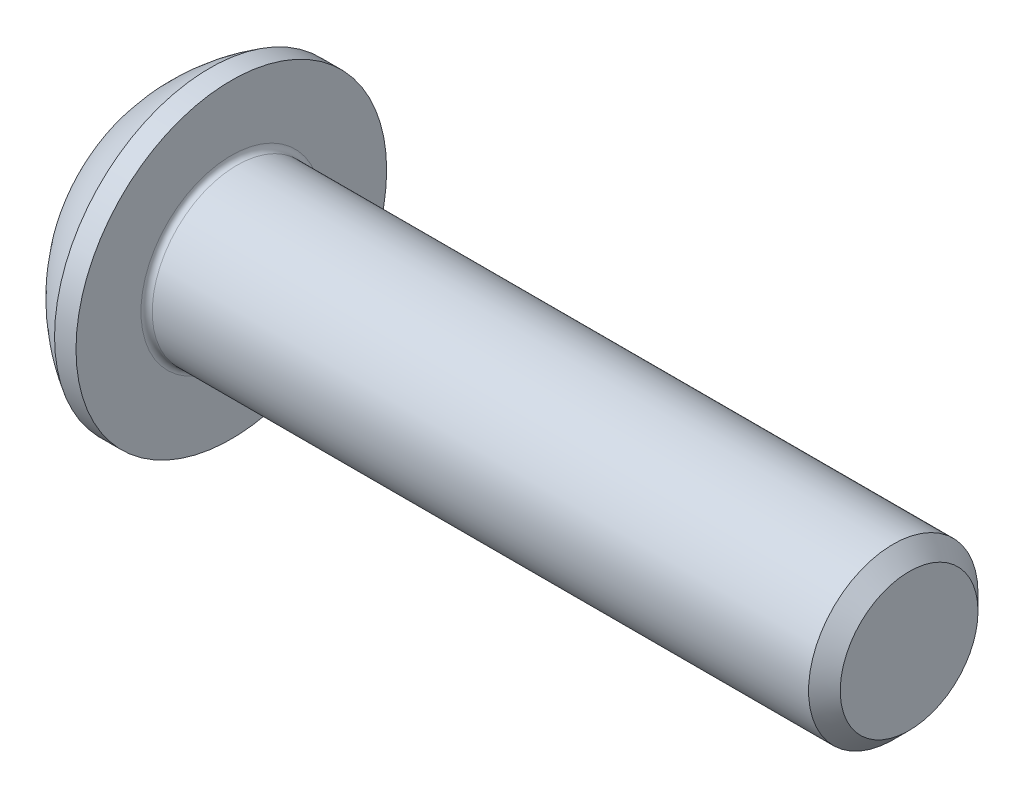
ISO-10303-21;
HEADER;
FILE_DESCRIPTION(('STEP AP214'),'2;1');
FILE_NAME('part.step','',(''),(''),'','','');
FILE_SCHEMA(('AUTOMOTIVE_DESIGN { 1 0 10303 214 1 1 1 1 }'));
ENDSEC;
DATA;
#1=APPLICATION_CONTEXT('core data for automotive mechanical design processes');
#2=APPLICATION_PROTOCOL_DEFINITION('international standard','automotive_design',2000,#1);
#3=PRODUCT_CONTEXT('',#1,'mechanical');
#4=PRODUCT('Part','Part','',(#3));
#5=PRODUCT_RELATED_PRODUCT_CATEGORY('part','',(#4));
#6=PRODUCT_DEFINITION_FORMATION('','',#4);
#7=PRODUCT_DEFINITION_CONTEXT('part definition',#1,'design');
#8=PRODUCT_DEFINITION('design','',#6,#7);
#9=PRODUCT_DEFINITION_SHAPE('','',#8);
#10=(LENGTH_UNIT() NAMED_UNIT(*) SI_UNIT(.MILLI.,.METRE.));
#11=(NAMED_UNIT(*) PLANE_ANGLE_UNIT() SI_UNIT($,.RADIAN.));
#12=(NAMED_UNIT(*) SI_UNIT($,.STERADIAN.) SOLID_ANGLE_UNIT());
#13=UNCERTAINTY_MEASURE_WITH_UNIT(LENGTH_MEASURE(1.E-05),#10,'distance_accuracy_value','');
#14=(GEOMETRIC_REPRESENTATION_CONTEXT(3) GLOBAL_UNCERTAINTY_ASSIGNED_CONTEXT((#13)) GLOBAL_UNIT_ASSIGNED_CONTEXT((#10,
#11,#12)) REPRESENTATION_CONTEXT('',''));
#15=CARTESIAN_POINT('',(0.,0.,0.));
#16=DIRECTION('',(0.,0.,1.));
#17=DIRECTION('',(1.,0.,0.));
#18=AXIS2_PLACEMENT_3D('',#15,#16,#17);
#19=CARTESIAN_POINT('',(1.04,0.,0.));
#20=DIRECTION('',(-1.,0.,0.));
#21=DIRECTION('',(0.,0.,1.));
#22=AXIS2_PLACEMENT_3D('',#19,#20,#21);
#23=PLANE('',#22);
#24=DIRECTION('',(0.,-1.,0.));
#25=VECTOR('',#24,1.);
#26=CARTESIAN_POINT('',(1.04,0.577350269189628,-1.));
#27=LINE('',#26,#25);
#28=CARTESIAN_POINT('',(1.04,0.577350269189628,-1.));
#29=VERTEX_POINT('',#28);
#30=CARTESIAN_POINT('',(1.04,0.,-1.));
#31=VERTEX_POINT('',#30);
#32=EDGE_CURVE('E251',#29,#31,#27,.T.);
#33=ORIENTED_EDGE('',*,*,#32,.T.);
#34=CARTESIAN_POINT('',(1.04,0.,0.));
#35=DIRECTION('',(1.,0.,0.));
#36=DIRECTION('',(0.,0.,-1.));
#37=AXIS2_PLACEMENT_3D('',#34,#35,#36);
#38=CIRCLE('',#37,0.999999999983859);
#39=CARTESIAN_POINT('',(1.04,0.866025403770461,-0.499999999991928));
#40=VERTEX_POINT('',#39);
#41=EDGE_CURVE('E47',#31,#40,#38,.T.);
#42=ORIENTED_EDGE('',*,*,#41,.T.);
#43=DIRECTION('',(0.,-0.499999999999999,-0.866025403784439));
#44=VECTOR('',#43,1.);
#45=CARTESIAN_POINT('',(1.04,1.15470053837925,0.));
#46=LINE('',#45,#44);
#47=EDGE_CURVE('E222',#40,#29,#46,.T.);
#48=ORIENTED_EDGE('',*,*,#47,.T.);
#49=EDGE_LOOP('',(#33,#42,#48));
#50=FACE_BOUND('',#49,.T.);
#51=ADVANCED_FACE('F32',(#50),#23,.T.);
#52=CARTESIAN_POINT('',(1.04,1.15470053837925,0.));
#53=VERTEX_POINT('',#52);
#54=EDGE_CURVE('E254',#53,#40,#46,.T.);
#55=ORIENTED_EDGE('',*,*,#54,.T.);
#56=CARTESIAN_POINT('',(1.04,0.866025403770461,0.499999999991928));
#57=VERTEX_POINT('',#56);
#58=EDGE_CURVE('E186',#40,#57,#38,.T.);
#59=ORIENTED_EDGE('',*,*,#58,.T.);
#60=DIRECTION('',(0.,0.499999999999999,-0.866025403784439));
#61=VECTOR('',#60,1.);
#62=CARTESIAN_POINT('',(1.04,0.577350269189628,1.));
#63=LINE('',#62,#61);
#64=EDGE_CURVE('E238',#57,#53,#63,.T.);
#65=ORIENTED_EDGE('',*,*,#64,.T.);
#66=EDGE_LOOP('',(#55,#59,#65));
#67=FACE_BOUND('',#66,.T.);
#68=ADVANCED_FACE('F122',(#67),#23,.T.);
#69=CARTESIAN_POINT('',(1.04,0.577350269189628,1.));
#70=VERTEX_POINT('',#69);
#71=EDGE_CURVE('E210',#70,#57,#63,.T.);
#72=ORIENTED_EDGE('',*,*,#71,.T.);
#73=CARTESIAN_POINT('',(1.04,0.,0.999999999983859));
#74=VERTEX_POINT('',#73);
#75=EDGE_CURVE('E190',#57,#74,#38,.T.);
#76=ORIENTED_EDGE('',*,*,#75,.T.);
#77=DIRECTION('',(0.,1.,0.));
#78=VECTOR('',#77,1.);
#79=CARTESIAN_POINT('',(1.04,-0.577350269189625,1.));
#80=LINE('',#79,#78);
#81=EDGE_CURVE('E242',#74,#70,#80,.T.);
#82=ORIENTED_EDGE('',*,*,#81,.T.);
#83=EDGE_LOOP('',(#72,#76,#82));
#84=FACE_BOUND('',#83,.T.);
#85=ADVANCED_FACE('F127',(#84),#23,.T.);
#86=CARTESIAN_POINT('',(1.04,-0.577350269189625,1.));
#87=VERTEX_POINT('',#86);
#88=EDGE_CURVE('E239',#87,#74,#80,.T.);
#89=ORIENTED_EDGE('',*,*,#88,.T.);
#90=CARTESIAN_POINT('',(1.04,-0.866025403770461,0.499999999991928));
#91=VERTEX_POINT('',#90);
#92=EDGE_CURVE('E260',#74,#91,#38,.T.);
#93=ORIENTED_EDGE('',*,*,#92,.T.);
#94=DIRECTION('',(0.,0.499999999999998,0.86602540378444));
#95=VECTOR('',#94,1.);
#96=CARTESIAN_POINT('',(1.04,-1.15470053837925,0.));
#97=LINE('',#96,#95);
#98=EDGE_CURVE('E246',#91,#87,#97,.T.);
#99=ORIENTED_EDGE('',*,*,#98,.T.);
#100=EDGE_LOOP('',(#89,#93,#99));
#101=FACE_BOUND('',#100,.T.);
#102=ADVANCED_FACE('F272',(#101),#23,.T.);
#103=CARTESIAN_POINT('',(1.04,-1.15470053837925,0.));
#104=VERTEX_POINT('',#103);
#105=EDGE_CURVE('E243',#104,#91,#97,.T.);
#106=ORIENTED_EDGE('',*,*,#105,.T.);
#107=CARTESIAN_POINT('',(1.04,-0.866025403770461,-0.499999999991927));
#108=VERTEX_POINT('',#107);
#109=EDGE_CURVE('E257',#91,#108,#38,.T.);
#110=ORIENTED_EDGE('',*,*,#109,.T.);
#111=DIRECTION('',(0.,-0.499999999999998,0.86602540378444));
#112=VECTOR('',#111,1.);
#113=CARTESIAN_POINT('',(1.04,-0.577350269189626,-1.));
#114=LINE('',#113,#112);
#115=EDGE_CURVE('E250',#108,#104,#114,.T.);
#116=ORIENTED_EDGE('',*,*,#115,.T.);
#117=EDGE_LOOP('',(#106,#110,#116));
#118=FACE_BOUND('',#117,.T.);
#119=ADVANCED_FACE('F120',(#118),#23,.T.);
#120=CARTESIAN_POINT('',(1.65,0.,0.));
#121=DIRECTION('',(-1.,0.,0.));
#122=DIRECTION('',(0.,0.,1.));
#123=AXIS2_PLACEMENT_3D('',#120,#121,#122);
#124=CYLINDRICAL_SURFACE('',#123,2.75);
#125=CARTESIAN_POINT('',(1.65,0.,0.));
#126=DIRECTION('',(-1.,0.,0.));
#127=DIRECTION('',(0.,0.,1.));
#128=AXIS2_PLACEMENT_3D('',#125,#126,#127);
#129=CIRCLE('',#128,2.75);
#130=CARTESIAN_POINT('',(1.65,0.,2.75));
#131=VERTEX_POINT('',#130);
#132=EDGE_CURVE('E193',#131,#131,#129,.T.);
#133=ORIENTED_EDGE('',*,*,#132,.T.);
#134=EDGE_LOOP('',(#133));
#135=FACE_BOUND('',#134,.T.);
#136=CARTESIAN_POINT('',(1.27,0.,0.));
#137=DIRECTION('',(-1.,0.,0.));
#138=DIRECTION('',(0.,0.,1.));
#139=AXIS2_PLACEMENT_3D('',#136,#137,#138);
#140=CIRCLE('',#139,2.75);
#141=CARTESIAN_POINT('',(1.27,0.,2.75));
#142=VERTEX_POINT('',#141);
#143=EDGE_CURVE('E203',#142,#142,#140,.T.);
#144=ORIENTED_EDGE('',*,*,#143,.F.);
#145=EDGE_LOOP('',(#144));
#146=FACE_BOUND('',#145,.T.);
#147=ADVANCED_FACE('F164',(#135,#146),#124,.T.);
#148=CARTESIAN_POINT('',(1.65,2.75,0.));
#149=DIRECTION('',(1.,0.,0.));
#150=DIRECTION('',(0.,0.,-1.));
#151=AXIS2_PLACEMENT_3D('',#148,#149,#150);
#152=PLANE('',#151);
#153=CARTESIAN_POINT('',(1.65,0.,0.));
#154=DIRECTION('',(1.,0.,0.));
#155=DIRECTION('',(0.,0.,-1.));
#156=AXIS2_PLACEMENT_3D('',#153,#154,#155);
#157=CIRCLE('',#156,1.6);
#158=CARTESIAN_POINT('',(1.65,0.,-1.6));
#159=VERTEX_POINT('',#158);
#160=EDGE_CURVE('E181',#159,#159,#157,.F.);
#161=ORIENTED_EDGE('',*,*,#160,.T.);
#162=EDGE_LOOP('',(#161));
#163=FACE_BOUND('',#162,.T.);
#164=ORIENTED_EDGE('',*,*,#132,.F.);
#165=EDGE_LOOP('',(#164));
#166=FACE_BOUND('',#165,.T.);
#167=ADVANCED_FACE('F160',(#163,#166),#152,.T.);
#168=CARTESIAN_POINT('',(0.,0.,0.));
#169=DIRECTION('',(-1.,0.,0.));
#170=DIRECTION('',(0.,0.,1.));
#171=AXIS2_PLACEMENT_3D('',#168,#169,#170);
#172=PLANE('',#171);
#173=DIRECTION('',(0.,-0.499999999999999,-0.866025403784439));
#174=VECTOR('',#173,1.);
#175=CARTESIAN_POINT('',(0.,1.15470053837925,0.));
#176=LINE('',#175,#174);
#177=CARTESIAN_POINT('',(0.,1.15470053837925,0.));
#178=VERTEX_POINT('',#177);
#179=CARTESIAN_POINT('',(0.,0.577350269189628,-1.));
#180=VERTEX_POINT('',#179);
#181=EDGE_CURVE('E55',#178,#180,#176,.T.);
#182=ORIENTED_EDGE('',*,*,#181,.F.);
#183=DIRECTION('',(0.,0.499999999999999,-0.866025403784439));
#184=VECTOR('',#183,1.);
#185=CARTESIAN_POINT('',(0.,0.577350269189628,1.));
#186=LINE('',#185,#184);
#187=CARTESIAN_POINT('',(0.,0.577350269189628,1.));
#188=VERTEX_POINT('',#187);
#189=EDGE_CURVE('E219',#188,#178,#186,.T.);
#190=ORIENTED_EDGE('',*,*,#189,.F.);
#191=DIRECTION('',(0.,1.,0.));
#192=VECTOR('',#191,1.);
#193=CARTESIAN_POINT('',(0.,-0.577350269189625,1.));
#194=LINE('',#193,#192);
#195=CARTESIAN_POINT('',(0.,-0.577350269189625,1.));
#196=VERTEX_POINT('',#195);
#197=EDGE_CURVE('E223',#196,#188,#194,.T.);
#198=ORIENTED_EDGE('',*,*,#197,.F.);
#199=DIRECTION('',(0.,0.499999999999998,0.86602540378444));
#200=VECTOR('',#199,1.);
#201=CARTESIAN_POINT('',(0.,-1.15470053837925,0.));
#202=LINE('',#201,#200);
#203=CARTESIAN_POINT('',(0.,-1.15470053837925,0.));
#204=VERTEX_POINT('',#203);
#205=EDGE_CURVE('E226',#204,#196,#202,.T.);
#206=ORIENTED_EDGE('',*,*,#205,.F.);
#207=DIRECTION('',(0.,-0.499999999999998,0.86602540378444));
#208=VECTOR('',#207,1.);
#209=CARTESIAN_POINT('',(0.,-0.577350269189626,-1.));
#210=LINE('',#209,#208);
#211=CARTESIAN_POINT('',(0.,-0.577350269189626,-1.));
#212=VERTEX_POINT('',#211);
#213=EDGE_CURVE('E229',#212,#204,#210,.T.);
#214=ORIENTED_EDGE('',*,*,#213,.F.);
#215=DIRECTION('',(0.,-1.,0.));
#216=VECTOR('',#215,1.);
#217=CARTESIAN_POINT('',(0.,0.577350269189628,-1.));
#218=LINE('',#217,#216);
#219=EDGE_CURVE('E232',#180,#212,#218,.T.);
#220=ORIENTED_EDGE('',*,*,#219,.F.);
#221=EDGE_LOOP('',(#182,#190,#198,#206,#214,#220));
#222=FACE_BOUND('',#221,.T.);
#223=CARTESIAN_POINT('',(0.,0.,0.));
#224=DIRECTION('',(-1.,0.,0.));
#225=DIRECTION('',(0.,0.,1.));
#226=AXIS2_PLACEMENT_3D('',#223,#224,#225);
#227=CIRCLE('',#226,1.425);
#228=CARTESIAN_POINT('',(0.,0.,1.425));
#229=VERTEX_POINT('',#228);
#230=EDGE_CURVE('E200',#229,#229,#227,.T.);
#231=ORIENTED_EDGE('',*,*,#230,.T.);
#232=EDGE_LOOP('',(#231));
#233=FACE_BOUND('',#232,.T.);
#234=ADVANCED_FACE('F156',(#222,#233),#172,.T.);
#235=CARTESIAN_POINT('',(2.96202427690375,0.,0.));
#236=DIRECTION('',(-1.,0.,0.));
#237=DIRECTION('',(0.,0.,1.));
#238=AXIS2_PLACEMENT_3D('',#235,#236,#237);
#239=DEGENERATE_TOROIDAL_SURFACE('',#238,0.14293081635303,3.35141684393879,.F.);
#240=ORIENTED_EDGE('',*,*,#143,.T.);
#241=EDGE_LOOP('',(#240));
#242=FACE_BOUND('',#241,.T.);
#243=ORIENTED_EDGE('',*,*,#230,.F.);
#244=EDGE_LOOP('',(#243));
#245=FACE_BOUND('',#244,.T.);
#246=ADVANCED_FACE('F153',(#242,#245),#239,.F.);
#247=CARTESIAN_POINT('',(1.04,1.15470053837925,0.));
#248=DIRECTION('',(0.,0.866025403784439,-0.499999999999999));
#249=DIRECTION('',(0.,0.499999999999999,0.866025403784439));
#250=AXIS2_PLACEMENT_3D('',#247,#248,#249);
#251=PLANE('',#250);
#252=ORIENTED_EDGE('',*,*,#181,.T.);
#253=DIRECTION('',(-1.,0.,0.));
#254=VECTOR('',#253,1.);
#255=CARTESIAN_POINT('',(1.04,0.577350269189628,-1.));
#256=LINE('',#255,#254);
#257=EDGE_CURVE('E207',#29,#180,#256,.T.);
#258=ORIENTED_EDGE('',*,*,#257,.F.);
#259=ORIENTED_EDGE('',*,*,#47,.F.);
#260=ORIENTED_EDGE('',*,*,#54,.F.);
#261=DIRECTION('',(-1.,0.,0.));
#262=VECTOR('',#261,1.);
#263=CARTESIAN_POINT('',(1.04,1.15470053837925,0.));
#264=LINE('',#263,#262);
#265=EDGE_CURVE('E206',#53,#178,#264,.T.);
#266=ORIENTED_EDGE('',*,*,#265,.T.);
#267=EDGE_LOOP('',(#252,#258,#259,#260,#266));
#268=FACE_BOUND('',#267,.T.);
#269=ADVANCED_FACE('F135',(#268),#251,.F.);
#270=CARTESIAN_POINT('',(1.04,0.577350269189628,1.));
#271=DIRECTION('',(0.,0.866025403784439,0.499999999999999));
#272=DIRECTION('',(0.,-0.499999999999999,0.866025403784439));
#273=AXIS2_PLACEMENT_3D('',#270,#271,#272);
#274=PLANE('',#273);
#275=ORIENTED_EDGE('',*,*,#189,.T.);
#276=ORIENTED_EDGE('',*,*,#265,.F.);
#277=ORIENTED_EDGE('',*,*,#64,.F.);
#278=ORIENTED_EDGE('',*,*,#71,.F.);
#279=DIRECTION('',(-1.,0.,0.));
#280=VECTOR('',#279,1.);
#281=CARTESIAN_POINT('',(1.04,0.577350269189628,1.));
#282=LINE('',#281,#280);
#283=EDGE_CURVE('E216',#70,#188,#282,.T.);
#284=ORIENTED_EDGE('',*,*,#283,.T.);
#285=EDGE_LOOP('',(#275,#276,#277,#278,#284));
#286=FACE_BOUND('',#285,.T.);
#287=ADVANCED_FACE('F131',(#286),#274,.F.);
#288=CARTESIAN_POINT('',(1.04,-0.577350269189625,1.));
#289=DIRECTION('',(0.,0.,1.));
#290=DIRECTION('',(1.,0.,0.));
#291=AXIS2_PLACEMENT_3D('',#288,#289,#290);
#292=PLANE('',#291);
#293=ORIENTED_EDGE('',*,*,#197,.T.);
#294=ORIENTED_EDGE('',*,*,#283,.F.);
#295=ORIENTED_EDGE('',*,*,#81,.F.);
#296=ORIENTED_EDGE('',*,*,#88,.F.);
#297=DIRECTION('',(-1.,0.,0.));
#298=VECTOR('',#297,1.);
#299=CARTESIAN_POINT('',(1.04,-0.577350269189625,1.));
#300=LINE('',#299,#298);
#301=EDGE_CURVE('E214',#87,#196,#300,.T.);
#302=ORIENTED_EDGE('',*,*,#301,.T.);
#303=EDGE_LOOP('',(#293,#294,#295,#296,#302));
#304=FACE_BOUND('',#303,.T.);
#305=ADVANCED_FACE('F134',(#304),#292,.F.);
#306=CARTESIAN_POINT('',(1.04,-1.15470053837925,0.));
#307=DIRECTION('',(0.,-0.86602540378444,0.499999999999998));
#308=DIRECTION('',(0.,-0.499999999999998,-0.86602540378444));
#309=AXIS2_PLACEMENT_3D('',#306,#307,#308);
#310=PLANE('',#309);
#311=ORIENTED_EDGE('',*,*,#205,.T.);
#312=ORIENTED_EDGE('',*,*,#301,.F.);
#313=ORIENTED_EDGE('',*,*,#98,.F.);
#314=ORIENTED_EDGE('',*,*,#105,.F.);
#315=DIRECTION('',(-1.,0.,0.));
#316=VECTOR('',#315,1.);
#317=CARTESIAN_POINT('',(1.04,-1.15470053837925,0.));
#318=LINE('',#317,#316);
#319=EDGE_CURVE('E212',#104,#204,#318,.T.);
#320=ORIENTED_EDGE('',*,*,#319,.T.);
#321=EDGE_LOOP('',(#311,#312,#313,#314,#320));
#322=FACE_BOUND('',#321,.T.);
#323=ADVANCED_FACE('F139',(#322),#310,.F.);
#324=CARTESIAN_POINT('',(1.04,-0.577350269189626,-1.));
#325=DIRECTION('',(0.,-0.86602540378444,-0.499999999999998));
#326=DIRECTION('',(0.,0.499999999999998,-0.86602540378444));
#327=AXIS2_PLACEMENT_3D('',#324,#325,#326);
#328=PLANE('',#327);
#329=ORIENTED_EDGE('',*,*,#213,.T.);
#330=ORIENTED_EDGE('',*,*,#319,.F.);
#331=ORIENTED_EDGE('',*,*,#115,.F.);
#332=CARTESIAN_POINT('',(1.04,-0.577350269189626,-1.));
#333=VERTEX_POINT('',#332);
#334=EDGE_CURVE('E247',#333,#108,#114,.T.);
#335=ORIENTED_EDGE('',*,*,#334,.F.);
#336=DIRECTION('',(-1.,0.,0.));
#337=VECTOR('',#336,1.);
#338=CARTESIAN_POINT('',(1.04,-0.577350269189626,-1.));
#339=LINE('',#338,#337);
#340=EDGE_CURVE('E209',#333,#212,#339,.T.);
#341=ORIENTED_EDGE('',*,*,#340,.T.);
#342=EDGE_LOOP('',(#329,#330,#331,#335,#341));
#343=FACE_BOUND('',#342,.T.);
#344=ADVANCED_FACE('F143',(#343),#328,.F.);
#345=CARTESIAN_POINT('',(1.04,0.577350269189628,-1.));
#346=DIRECTION('',(0.,0.,-1.));
#347=DIRECTION('',(-1.,0.,0.));
#348=AXIS2_PLACEMENT_3D('',#345,#346,#347);
#349=PLANE('',#348);
#350=ORIENTED_EDGE('',*,*,#219,.T.);
#351=ORIENTED_EDGE('',*,*,#340,.F.);
#352=EDGE_CURVE('E253',#31,#333,#27,.T.);
#353=ORIENTED_EDGE('',*,*,#352,.F.);
#354=ORIENTED_EDGE('',*,*,#32,.F.);
#355=ORIENTED_EDGE('',*,*,#257,.T.);
#356=EDGE_LOOP('',(#350,#351,#353,#354,#355));
#357=FACE_BOUND('',#356,.T.);
#358=ADVANCED_FACE('F117',(#357),#349,.F.);
#359=ORIENTED_EDGE('',*,*,#334,.T.);
#360=EDGE_CURVE('E199',#108,#31,#38,.T.);
#361=ORIENTED_EDGE('',*,*,#360,.T.);
#362=ORIENTED_EDGE('',*,*,#352,.T.);
#363=EDGE_LOOP('',(#359,#361,#362));
#364=FACE_BOUND('',#363,.T.);
#365=ADVANCED_FACE('F108',(#364),#23,.T.);
#366=CARTESIAN_POINT('',(1.61735026918031,0.,0.));
#367=DIRECTION('',(-1.,0.,0.));
#368=DIRECTION('',(0.,0.,1.));
#369=AXIS2_PLACEMENT_3D('',#366,#367,#368);
#370=CONICAL_SURFACE('',#369,0.,1.0471975511966);
#371=ORIENTED_EDGE('',*,*,#41,.F.);
#372=ORIENTED_EDGE('',*,*,#360,.F.);
#373=ORIENTED_EDGE('',*,*,#109,.F.);
#374=ORIENTED_EDGE('',*,*,#92,.F.);
#375=ORIENTED_EDGE('',*,*,#75,.F.);
#376=ORIENTED_EDGE('',*,*,#58,.F.);
#377=EDGE_LOOP('',(#371,#372,#373,#374,#375,#376));
#378=FACE_BOUND('',#377,.T.);
#379=CARTESIAN_POINT('',(1.61735026918031,0.,0.));
#380=VERTEX_POINT('',#379);
#381=VERTEX_LOOP('',#380);
#382=FACE_BOUND('',#381,.T.);
#383=ADVANCED_FACE('F105',(#378,#382),#370,.F.);
#384=CARTESIAN_POINT('',(13.65,0.,0.));
#385=DIRECTION('',(-1.,0.,0.));
#386=DIRECTION('',(0.,0.,1.));
#387=AXIS2_PLACEMENT_3D('',#384,#385,#386);
#388=CYLINDRICAL_SURFACE('',#387,1.5);
#389=CARTESIAN_POINT('',(13.3695,0.,0.));
#390=DIRECTION('',(1.,0.,0.));
#391=DIRECTION('',(0.,0.,-1.));
#392=AXIS2_PLACEMENT_3D('',#389,#390,#391);
#393=CIRCLE('',#392,1.5);
#394=CARTESIAN_POINT('',(13.3695,0.,-1.5));
#395=VERTEX_POINT('',#394);
#396=EDGE_CURVE('E11',#395,#395,#393,.F.);
#397=ORIENTED_EDGE('',*,*,#396,.T.);
#398=EDGE_LOOP('',(#397));
#399=FACE_BOUND('',#398,.T.);
#400=CARTESIAN_POINT('',(1.75,0.,0.));
#401=DIRECTION('',(1.,0.,0.));
#402=DIRECTION('',(0.,0.,-1.));
#403=AXIS2_PLACEMENT_3D('',#400,#401,#402);
#404=CIRCLE('',#403,1.5);
#405=CARTESIAN_POINT('',(1.75,0.,-1.5));
#406=VERTEX_POINT('',#405);
#407=EDGE_CURVE('E184',#406,#406,#404,.T.);
#408=ORIENTED_EDGE('',*,*,#407,.T.);
#409=EDGE_LOOP('',(#408));
#410=FACE_BOUND('',#409,.T.);
#411=ADVANCED_FACE('F107',(#399,#410),#388,.T.);
#412=CARTESIAN_POINT('',(13.65,0.,0.));
#413=DIRECTION('',(1.,0.,0.));
#414=DIRECTION('',(0.,0.,-1.));
#415=AXIS2_PLACEMENT_3D('',#412,#413,#414);
#416=PLANE('',#415);
#417=CARTESIAN_POINT('',(13.65,0.,0.));
#418=DIRECTION('',(1.,0.,0.));
#419=DIRECTION('',(0.,0.,-1.));
#420=AXIS2_PLACEMENT_3D('',#417,#418,#419);
#421=CIRCLE('',#420,1.2195);
#422=CARTESIAN_POINT('',(13.65,0.,-1.2195));
#423=VERTEX_POINT('',#422);
#424=EDGE_CURVE('E40',#423,#423,#421,.T.);
#425=ORIENTED_EDGE('',*,*,#424,.T.);
#426=EDGE_LOOP('',(#425));
#427=FACE_BOUND('',#426,.T.);
#428=ADVANCED_FACE('F114',(#427),#416,.T.);
#429=CARTESIAN_POINT('',(1.75,0.,0.));
#430=DIRECTION('',(1.,0.,0.));
#431=DIRECTION('',(0.,0.,-1.));
#432=AXIS2_PLACEMENT_3D('',#429,#430,#431);
#433=TOROIDAL_SURFACE('',#432,1.6,0.1);
#434=ORIENTED_EDGE('',*,*,#160,.F.);
#435=EDGE_LOOP('',(#434));
#436=FACE_BOUND('',#435,.T.);
#437=ORIENTED_EDGE('',*,*,#407,.F.);
#438=EDGE_LOOP('',(#437));
#439=FACE_BOUND('',#438,.T.);
#440=ADVANCED_FACE('F168',(#436,#439),#433,.F.);
#441=CARTESIAN_POINT('',(13.65,0.,0.));
#442=DIRECTION('',(-1.,0.,0.));
#443=DIRECTION('',(0.,0.,1.));
#444=AXIS2_PLACEMENT_3D('',#441,#442,#443);
#445=CONICAL_SURFACE('',#444,1.2195,0.785398163397446);
#446=ORIENTED_EDGE('',*,*,#396,.F.);
#447=EDGE_LOOP('',(#446));
#448=FACE_BOUND('',#447,.T.);
#449=ORIENTED_EDGE('',*,*,#424,.F.);
#450=EDGE_LOOP('',(#449));
#451=FACE_BOUND('',#450,.T.);
#452=ADVANCED_FACE('F34',(#448,#451),#445,.T.);
#453=CLOSED_SHELL('',(#51,#68,#85,#102,#119,#147,#167,#234,#246,#269,#287,#305,#323,#344,#358,
#365,#383,#411,#428,#440,#452));
#454=MANIFOLD_SOLID_BREP('B2',#453);
#455=ADVANCED_BREP_SHAPE_REPRESENTATION('',(#18,#454),#14);
#456=SHAPE_DEFINITION_REPRESENTATION(#9,#455);
ENDSEC;
END-ISO-10303-21;
